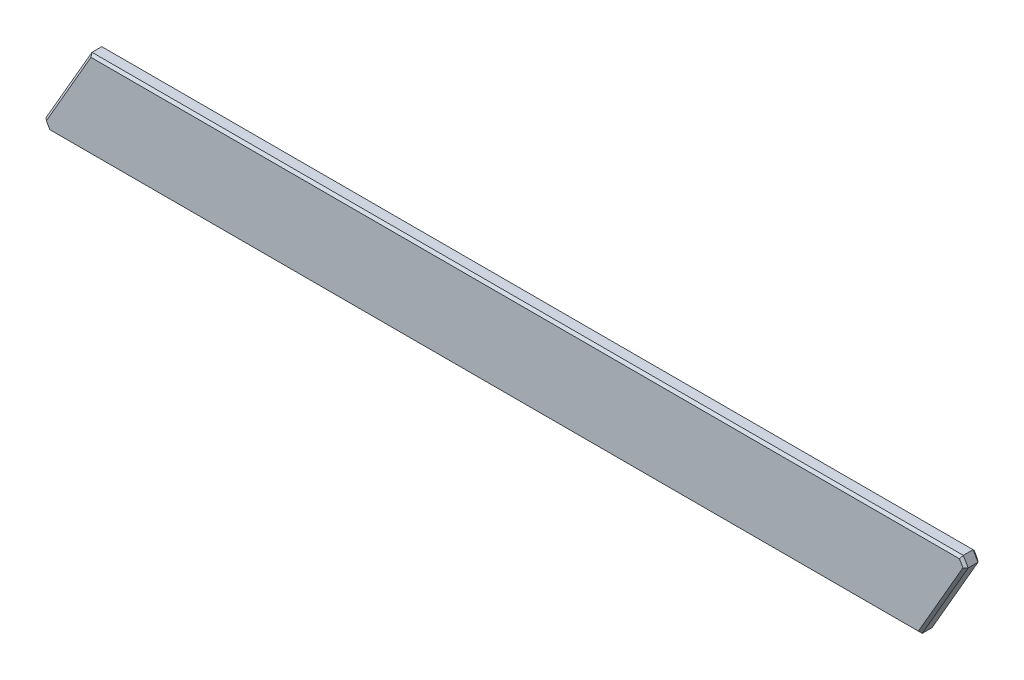
ISO-10303-21;
HEADER;
FILE_DESCRIPTION(('STEP AP214'),'2;1');
FILE_NAME('part.step','',(''),(''),'','','');
FILE_SCHEMA(('AUTOMOTIVE_DESIGN { 1 0 10303 214 1 1 1 1 }'));
ENDSEC;
DATA;
#1=APPLICATION_CONTEXT('core data for automotive mechanical design processes');
#2=APPLICATION_PROTOCOL_DEFINITION('international standard','automotive_design',2000,#1);
#3=PRODUCT_CONTEXT('',#1,'mechanical');
#4=PRODUCT('Part','Part','',(#3));
#5=PRODUCT_RELATED_PRODUCT_CATEGORY('part','',(#4));
#6=PRODUCT_DEFINITION_FORMATION('','',#4);
#7=PRODUCT_DEFINITION_CONTEXT('part definition',#1,'design');
#8=PRODUCT_DEFINITION('design','',#6,#7);
#9=PRODUCT_DEFINITION_SHAPE('','',#8);
#10=(LENGTH_UNIT() NAMED_UNIT(*) SI_UNIT(.MILLI.,.METRE.));
#11=(NAMED_UNIT(*) PLANE_ANGLE_UNIT() SI_UNIT($,.RADIAN.));
#12=(NAMED_UNIT(*) SI_UNIT($,.STERADIAN.) SOLID_ANGLE_UNIT());
#13=UNCERTAINTY_MEASURE_WITH_UNIT(LENGTH_MEASURE(1.E-05),#10,'distance_accuracy_value','');
#14=(GEOMETRIC_REPRESENTATION_CONTEXT(3) GLOBAL_UNCERTAINTY_ASSIGNED_CONTEXT((#13)) GLOBAL_UNIT_ASSIGNED_CONTEXT((#10,
#11,#12)) REPRESENTATION_CONTEXT('',''));
#15=CARTESIAN_POINT('',(0.,0.,0.));
#16=DIRECTION('',(0.,0.,1.));
#17=DIRECTION('',(1.,0.,0.));
#18=AXIS2_PLACEMENT_3D('',#15,#16,#17);
#19=CARTESIAN_POINT('',(94.1961524227066,7.26794919243112,3.));
#20=DIRECTION('',(-0.86602540378444,0.499999999999998,0.));
#21=DIRECTION('',(-0.499999999999998,-0.86602540378444,0.));
#22=AXIS2_PLACEMENT_3D('',#19,#20,#21);
#23=PLANE('',#22);
#24=DIRECTION('',(0.,0.,-1.));
#25=VECTOR('',#24,1.);
#26=CARTESIAN_POINT('',(84.8038475772934,-9.,3.));
#27=LINE('',#26,#25);
#28=CARTESIAN_POINT('',(84.8038475772934,-9.,2.49999999999998));
#29=VERTEX_POINT('',#28);
#30=CARTESIAN_POINT('',(84.8038475772934,-9.,0.5));
#31=VERTEX_POINT('',#30);
#32=EDGE_CURVE('E222',#29,#31,#27,.T.);
#33=ORIENTED_EDGE('',*,*,#32,.T.);
#34=DIRECTION('',(0.499999999999998,0.86602540378444,0.));
#35=VECTOR('',#34,1.);
#36=CARTESIAN_POINT('',(94.1961524227066,7.26794919243112,0.5));
#37=LINE('',#36,#35);
#38=CARTESIAN_POINT('',(94.1961524227066,7.26794919243112,0.5));
#39=VERTEX_POINT('',#38);
#40=EDGE_CURVE('E197',#31,#39,#37,.T.);
#41=ORIENTED_EDGE('',*,*,#40,.T.);
#42=DIRECTION('',(0.,0.,-1.));
#43=VECTOR('',#42,1.);
#44=CARTESIAN_POINT('',(94.1961524227066,7.26794919243112,3.));
#45=LINE('',#44,#43);
#46=CARTESIAN_POINT('',(94.1961524227066,7.26794919243112,2.49999999999998));
#47=VERTEX_POINT('',#46);
#48=EDGE_CURVE('E151',#47,#39,#45,.T.);
#49=ORIENTED_EDGE('',*,*,#48,.F.);
#50=DIRECTION('',(-0.499999999999998,-0.86602540378444,0.));
#51=VECTOR('',#50,1.);
#52=CARTESIAN_POINT('',(94.1961524227066,7.26794919243112,2.49999999999998));
#53=LINE('',#52,#51);
#54=EDGE_CURVE('E195',#47,#29,#53,.T.);
#55=ORIENTED_EDGE('',*,*,#54,.T.);
#56=EDGE_LOOP('',(#33,#41,#49,#55));
#57=FACE_BOUND('',#56,.T.);
#58=ADVANCED_FACE('F38',(#57),#23,.F.);
#59=CARTESIAN_POINT('',(93.1961524227066,9.,3.));
#60=DIRECTION('',(-0.866025403784439,-0.5,0.));
#61=DIRECTION('',(0.5,-0.866025403784439,0.));
#62=AXIS2_PLACEMENT_3D('',#59,#60,#61);
#63=PLANE('',#62);
#64=ORIENTED_EDGE('',*,*,#48,.T.);
#65=DIRECTION('',(-0.5,0.866025403784439,0.));
#66=VECTOR('',#65,1.);
#67=CARTESIAN_POINT('',(93.1961524227066,9.,0.5));
#68=LINE('',#67,#66);
#69=CARTESIAN_POINT('',(93.1961524227066,9.,0.5));
#70=VERTEX_POINT('',#69);
#71=EDGE_CURVE('E150',#39,#70,#68,.T.);
#72=ORIENTED_EDGE('',*,*,#71,.T.);
#73=DIRECTION('',(0.,0.,-1.));
#74=VECTOR('',#73,1.);
#75=CARTESIAN_POINT('',(93.1961524227066,9.,3.));
#76=LINE('',#75,#74);
#77=CARTESIAN_POINT('',(93.1961524227066,9.,2.49999999999997));
#78=VERTEX_POINT('',#77);
#79=EDGE_CURVE('E132',#78,#70,#76,.T.);
#80=ORIENTED_EDGE('',*,*,#79,.F.);
#81=DIRECTION('',(0.5,-0.866025403784439,0.));
#82=VECTOR('',#81,1.);
#83=CARTESIAN_POINT('',(93.1961524227066,9.,2.49999999999997));
#84=LINE('',#83,#82);
#85=EDGE_CURVE('E147',#78,#47,#84,.T.);
#86=ORIENTED_EDGE('',*,*,#85,.T.);
#87=EDGE_LOOP('',(#64,#72,#80,#86));
#88=FACE_BOUND('',#87,.T.);
#89=ADVANCED_FACE('F145',(#88),#63,.F.);
#90=CARTESIAN_POINT('',(-84.8038475772934,9.,3.));
#91=DIRECTION('',(0.,-1.,0.));
#92=DIRECTION('',(0.,0.,-1.));
#93=AXIS2_PLACEMENT_3D('',#90,#91,#92);
#94=PLANE('',#93);
#95=ORIENTED_EDGE('',*,*,#79,.T.);
#96=DIRECTION('',(-1.,0.,0.));
#97=VECTOR('',#96,1.);
#98=CARTESIAN_POINT('',(-84.8038475772934,9.,0.5));
#99=LINE('',#98,#97);
#100=CARTESIAN_POINT('',(-84.8038475772934,9.,0.5));
#101=VERTEX_POINT('',#100);
#102=EDGE_CURVE('E139',#70,#101,#99,.T.);
#103=ORIENTED_EDGE('',*,*,#102,.T.);
#104=DIRECTION('',(0.,0.,-1.));
#105=VECTOR('',#104,1.);
#106=CARTESIAN_POINT('',(-84.8038475772934,9.,3.));
#107=LINE('',#106,#105);
#108=CARTESIAN_POINT('',(-84.8038475772934,9.,2.49999999999997));
#109=VERTEX_POINT('',#108);
#110=EDGE_CURVE('E134',#109,#101,#107,.T.);
#111=ORIENTED_EDGE('',*,*,#110,.F.);
#112=DIRECTION('',(1.,0.,0.));
#113=VECTOR('',#112,1.);
#114=CARTESIAN_POINT('',(-84.8038475772934,9.,2.49999999999997));
#115=LINE('',#114,#113);
#116=EDGE_CURVE('E129',#109,#78,#115,.T.);
#117=ORIENTED_EDGE('',*,*,#116,.T.);
#118=EDGE_LOOP('',(#95,#103,#111,#117));
#119=FACE_BOUND('',#118,.T.);
#120=ADVANCED_FACE('F131',(#119),#94,.F.);
#121=CARTESIAN_POINT('',(-94.1961524227066,-7.26794919243114,3.));
#122=DIRECTION('',(0.86602540378444,-0.499999999999998,0.));
#123=DIRECTION('',(0.499999999999998,0.86602540378444,0.));
#124=AXIS2_PLACEMENT_3D('',#121,#122,#123);
#125=PLANE('',#124);
#126=ORIENTED_EDGE('',*,*,#110,.T.);
#127=DIRECTION('',(-0.499999999999998,-0.86602540378444,0.));
#128=VECTOR('',#127,1.);
#129=CARTESIAN_POINT('',(-94.1961524227066,-7.26794919243114,0.5));
#130=LINE('',#129,#128);
#131=CARTESIAN_POINT('',(-94.1961524227066,-7.26794919243114,0.5));
#132=VERTEX_POINT('',#131);
#133=EDGE_CURVE('E184',#101,#132,#130,.T.);
#134=ORIENTED_EDGE('',*,*,#133,.T.);
#135=DIRECTION('',(0.,0.,-1.));
#136=VECTOR('',#135,1.);
#137=CARTESIAN_POINT('',(-94.1961524227066,-7.26794919243114,3.));
#138=LINE('',#137,#136);
#139=CARTESIAN_POINT('',(-94.1961524227066,-7.26794919243114,2.49999999999997));
#140=VERTEX_POINT('',#139);
#141=EDGE_CURVE('E240',#140,#132,#138,.T.);
#142=ORIENTED_EDGE('',*,*,#141,.F.);
#143=DIRECTION('',(0.499999999999998,0.86602540378444,0.));
#144=VECTOR('',#143,1.);
#145=CARTESIAN_POINT('',(-94.1961524227066,-7.26794919243114,2.49999999999997));
#146=LINE('',#145,#144);
#147=EDGE_CURVE('E182',#140,#109,#146,.T.);
#148=ORIENTED_EDGE('',*,*,#147,.T.);
#149=EDGE_LOOP('',(#126,#134,#142,#148));
#150=FACE_BOUND('',#149,.T.);
#151=ADVANCED_FACE('F237',(#150),#125,.F.);
#152=CARTESIAN_POINT('',(-93.1961524227066,-9.00000000000002,3.));
#153=DIRECTION('',(0.866025403784436,0.500000000000004,0.));
#154=DIRECTION('',(-0.500000000000004,0.866025403784436,0.));
#155=AXIS2_PLACEMENT_3D('',#152,#153,#154);
#156=PLANE('',#155);
#157=ORIENTED_EDGE('',*,*,#141,.T.);
#158=DIRECTION('',(0.500000000000004,-0.866025403784436,0.));
#159=VECTOR('',#158,1.);
#160=CARTESIAN_POINT('',(-93.1961524227066,-9.00000000000002,0.5));
#161=LINE('',#160,#159);
#162=CARTESIAN_POINT('',(-93.1961524227066,-9.00000000000002,0.5));
#163=VERTEX_POINT('',#162);
#164=EDGE_CURVE('E188',#132,#163,#161,.T.);
#165=ORIENTED_EDGE('',*,*,#164,.T.);
#166=DIRECTION('',(0.,0.,-1.));
#167=VECTOR('',#166,1.);
#168=CARTESIAN_POINT('',(-93.1961524227066,-9.00000000000002,3.));
#169=LINE('',#168,#167);
#170=CARTESIAN_POINT('',(-93.1961524227066,-9.00000000000002,2.49999999999997));
#171=VERTEX_POINT('',#170);
#172=EDGE_CURVE('E243',#171,#163,#169,.T.);
#173=ORIENTED_EDGE('',*,*,#172,.F.);
#174=DIRECTION('',(-0.500000000000004,0.866025403784436,0.));
#175=VECTOR('',#174,1.);
#176=CARTESIAN_POINT('',(-93.1961524227066,-9.00000000000002,2.49999999999997));
#177=LINE('',#176,#175);
#178=EDGE_CURVE('E186',#171,#140,#177,.T.);
#179=ORIENTED_EDGE('',*,*,#178,.T.);
#180=EDGE_LOOP('',(#157,#165,#173,#179));
#181=FACE_BOUND('',#180,.T.);
#182=ADVANCED_FACE('F282',(#181),#156,.F.);
#183=CARTESIAN_POINT('',(84.8038475772934,-9.,3.));
#184=DIRECTION('',(0.,1.,0.));
#185=DIRECTION('',(-1.,0.,0.));
#186=AXIS2_PLACEMENT_3D('',#183,#184,#185);
#187=PLANE('',#186);
#188=ORIENTED_EDGE('',*,*,#172,.T.);
#189=DIRECTION('',(1.,0.,0.));
#190=VECTOR('',#189,1.);
#191=CARTESIAN_POINT('',(84.8038475772934,-9.,0.5));
#192=LINE('',#191,#190);
#193=EDGE_CURVE('E193',#163,#31,#192,.T.);
#194=ORIENTED_EDGE('',*,*,#193,.T.);
#195=ORIENTED_EDGE('',*,*,#32,.F.);
#196=DIRECTION('',(-1.,0.,0.));
#197=VECTOR('',#196,1.);
#198=CARTESIAN_POINT('',(84.8038475772934,-9.,2.49999999999997));
#199=LINE('',#198,#197);
#200=EDGE_CURVE('E190',#29,#171,#199,.T.);
#201=ORIENTED_EDGE('',*,*,#200,.T.);
#202=EDGE_LOOP('',(#188,#194,#195,#201));
#203=FACE_BOUND('',#202,.T.);
#204=ADVANCED_FACE('F283',(#203),#187,.F.);
#205=CARTESIAN_POINT('',(0.,0.,3.));
#206=DIRECTION('',(0.,0.,-1.));
#207=DIRECTION('',(-1.,0.,0.));
#208=AXIS2_PLACEMENT_3D('',#205,#206,#207);
#209=PLANE('',#208);
#210=DIRECTION('',(0.500000000000004,-0.866025403784436,0.));
#211=VECTOR('',#210,1.);
#212=CARTESIAN_POINT('',(-73.3612159321673,-42.3551177665155,3.));
#213=LINE('',#212,#211);
#214=CARTESIAN_POINT('',(-93.6188021535169,-7.26794919243115,3.));
#215=VERTEX_POINT('',#214);
#216=CARTESIAN_POINT('',(-92.9074772881117,-8.49999999999999,3.));
#217=VERTEX_POINT('',#216);
#218=EDGE_CURVE('E48',#215,#217,#213,.T.);
#219=ORIENTED_EDGE('',*,*,#218,.T.);
#220=DIRECTION('',(1.,0.,0.));
#221=VECTOR('',#220,1.);
#222=CARTESIAN_POINT('',(0.,-8.49999999999998,3.));
#223=LINE('',#222,#221);
#224=CARTESIAN_POINT('',(84.5151724426986,-8.49999999999997,3.));
#225=VERTEX_POINT('',#224);
#226=EDGE_CURVE('E11',#217,#225,#223,.T.);
#227=ORIENTED_EDGE('',*,*,#226,.T.);
#228=DIRECTION('',(0.499999999999998,0.86602540378444,0.));
#229=VECTOR('',#228,1.);
#230=CARTESIAN_POINT('',(67.066987298108,-38.7211431702996,3.));
#231=LINE('',#230,#229);
#232=CARTESIAN_POINT('',(93.618802153517,7.26794919243113,3.));
#233=VERTEX_POINT('',#232);
#234=EDGE_CURVE('E199',#225,#233,#231,.T.);
#235=ORIENTED_EDGE('',*,*,#234,.T.);
#236=DIRECTION('',(-0.5,0.866025403784439,0.));
#237=VECTOR('',#236,1.);
#238=CARTESIAN_POINT('',(73.3612159321677,42.3551177665153,3.));
#239=LINE('',#238,#237);
#240=CARTESIAN_POINT('',(92.9074772881118,8.49999999999997,3.));
#241=VERTEX_POINT('',#240);
#242=EDGE_CURVE('E201',#233,#241,#239,.T.);
#243=ORIENTED_EDGE('',*,*,#242,.T.);
#244=DIRECTION('',(-1.,0.,0.));
#245=VECTOR('',#244,1.);
#246=CARTESIAN_POINT('',(0.,8.49999999999997,3.));
#247=LINE('',#246,#245);
#248=CARTESIAN_POINT('',(-84.5151724426985,8.49999999999997,3.));
#249=VERTEX_POINT('',#248);
#250=EDGE_CURVE('E156',#241,#249,#247,.T.);
#251=ORIENTED_EDGE('',*,*,#250,.T.);
#252=DIRECTION('',(-0.499999999999998,-0.86602540378444,0.));
#253=VECTOR('',#252,1.);
#254=CARTESIAN_POINT('',(-67.0669872981079,38.7211431702996,3.));
#255=LINE('',#254,#253);
#256=EDGE_CURVE('E59',#249,#215,#255,.T.);
#257=ORIENTED_EDGE('',*,*,#256,.T.);
#258=EDGE_LOOP('',(#219,#227,#235,#243,#251,#257));
#259=FACE_BOUND('',#258,.T.);
#260=ADVANCED_FACE('F291',(#259),#209,.F.);
#261=CARTESIAN_POINT('',(0.,0.,0.));
#262=DIRECTION('',(0.,0.,-1.));
#263=DIRECTION('',(-1.,0.,0.));
#264=AXIS2_PLACEMENT_3D('',#261,#262,#263);
#265=PLANE('',#264);
#266=DIRECTION('',(1.,0.,0.));
#267=VECTOR('',#266,1.);
#268=CARTESIAN_POINT('',(93.1961524227066,8.49999999999998,0.));
#269=LINE('',#268,#267);
#270=CARTESIAN_POINT('',(-84.5151724426986,8.49999999999998,0.));
#271=VERTEX_POINT('',#270);
#272=CARTESIAN_POINT('',(92.9074772881118,8.49999999999998,0.));
#273=VERTEX_POINT('',#272);
#274=EDGE_CURVE('E177',#271,#273,#269,.T.);
#275=ORIENTED_EDGE('',*,*,#274,.T.);
#276=DIRECTION('',(0.5,-0.866025403784439,0.));
#277=VECTOR('',#276,1.);
#278=CARTESIAN_POINT('',(93.7631397208144,7.01794919243112,0.));
#279=LINE('',#278,#277);
#280=CARTESIAN_POINT('',(93.618802153517,7.26794919243113,0.));
#281=VERTEX_POINT('',#280);
#282=EDGE_CURVE('E140',#273,#281,#279,.T.);
#283=ORIENTED_EDGE('',*,*,#282,.T.);
#284=DIRECTION('',(-0.499999999999998,-0.86602540378444,0.));
#285=VECTOR('',#284,1.);
#286=CARTESIAN_POINT('',(84.3708348754012,-8.74999999999999,0.));
#287=LINE('',#286,#285);
#288=CARTESIAN_POINT('',(84.5151724426986,-8.49999999999998,0.));
#289=VERTEX_POINT('',#288);
#290=EDGE_CURVE('E166',#281,#289,#287,.T.);
#291=ORIENTED_EDGE('',*,*,#290,.T.);
#292=DIRECTION('',(-1.,0.,0.));
#293=VECTOR('',#292,1.);
#294=CARTESIAN_POINT('',(-93.1961524227066,-8.50000000000001,0.));
#295=LINE('',#294,#293);
#296=CARTESIAN_POINT('',(-92.9074772881118,-8.50000000000001,0.));
#297=VERTEX_POINT('',#296);
#298=EDGE_CURVE('E171',#289,#297,#295,.T.);
#299=ORIENTED_EDGE('',*,*,#298,.T.);
#300=DIRECTION('',(-0.500000000000004,0.866025403784436,0.));
#301=VECTOR('',#300,1.);
#302=CARTESIAN_POINT('',(-93.7631397208144,-7.01794919243113,0.));
#303=LINE('',#302,#301);
#304=CARTESIAN_POINT('',(-93.618802153517,-7.26794919243115,0.));
#305=VERTEX_POINT('',#304);
#306=EDGE_CURVE('E173',#297,#305,#303,.T.);
#307=ORIENTED_EDGE('',*,*,#306,.T.);
#308=DIRECTION('',(0.499999999999998,0.86602540378444,0.));
#309=VECTOR('',#308,1.);
#310=CARTESIAN_POINT('',(-84.3708348754011,8.74999999999999,0.));
#311=LINE('',#310,#309);
#312=EDGE_CURVE('E175',#305,#271,#311,.T.);
#313=ORIENTED_EDGE('',*,*,#312,.T.);
#314=EDGE_LOOP('',(#275,#283,#291,#299,#307,#313));
#315=FACE_BOUND('',#314,.T.);
#316=ADVANCED_FACE('F293',(#315),#265,.T.);
#317=CARTESIAN_POINT('',(-93.1961524227066,-9.00000000000002,0.5));
#318=DIRECTION('',(-0.612372435695788,-0.353553390593274,-0.707106781186552));
#319=DIRECTION('',(-0.500000000000004,0.866025403784436,0.));
#320=AXIS2_PLACEMENT_3D('',#317,#318,#319);
#321=PLANE('',#320);
#322=DIRECTION('',(0.755928946018465,0.,-0.654653670707965));
#323=VECTOR('',#322,1.);
#324=CARTESIAN_POINT('',(-93.624723851278,-7.26794919243115,0.0051283406945795));
#325=LINE('',#324,#323);
#326=EDGE_CURVE('E216',#305,#132,#325,.F.);
#327=ORIENTED_EDGE('',*,*,#326,.F.);
#328=ORIENTED_EDGE('',*,*,#306,.F.);
#329=DIRECTION('',(0.377964473009219,0.65465367070799,-0.654653670707969));
#330=VECTOR('',#329,1.);
#331=CARTESIAN_POINT('',(-67.7675809941363,35.0435776781799,-43.5435776781785));
#332=LINE('',#331,#330);
#333=EDGE_CURVE('E219',#163,#297,#332,.T.);
#334=ORIENTED_EDGE('',*,*,#333,.F.);
#335=ORIENTED_EDGE('',*,*,#164,.F.);
#336=EDGE_LOOP('',(#327,#328,#334,#335));
#337=FACE_BOUND('',#336,.T.);
#338=ADVANCED_FACE('F279',(#337),#321,.T.);
#339=CARTESIAN_POINT('',(84.8038475772934,-9.,0.5));
#340=DIRECTION('',(0.,-0.707106781186536,-0.707106781186559));
#341=DIRECTION('',(-1.,0.,0.));
#342=AXIS2_PLACEMENT_3D('',#339,#340,#341);
#343=PLANE('',#342);
#344=ORIENTED_EDGE('',*,*,#333,.T.);
#345=ORIENTED_EDGE('',*,*,#298,.F.);
#346=DIRECTION('',(-0.377964473009231,0.654653670707987,-0.654653670707966));
#347=VECTOR('',#346,1.);
#348=CARTESIAN_POINT('',(82.1203319071753,-4.35201451644809,-4.14798548355176));
#349=LINE('',#348,#347);
#350=EDGE_CURVE('E213',#31,#289,#349,.T.);
#351=ORIENTED_EDGE('',*,*,#350,.F.);
#352=ORIENTED_EDGE('',*,*,#193,.F.);
#353=EDGE_LOOP('',(#344,#345,#351,#352));
#354=FACE_BOUND('',#353,.T.);
#355=ADVANCED_FACE('F259',(#354),#343,.T.);
#356=CARTESIAN_POINT('',(-94.1961524227066,-7.26794919243114,0.5));
#357=DIRECTION('',(-0.612372435695781,0.353553390593264,-0.707106781186565));
#358=DIRECTION('',(0.499999999999998,0.86602540378444,0.));
#359=AXIS2_PLACEMENT_3D('',#356,#357,#358);
#360=PLANE('',#359);
#361=ORIENTED_EDGE('',*,*,#326,.T.);
#362=ORIENTED_EDGE('',*,*,#133,.F.);
#363=DIRECTION('',(0.377964473009244,-0.654653670707982,-0.654653670707962));
#364=VECTOR('',#363,1.);
#365=CARTESIAN_POINT('',(-82.1203319071752,4.35201451644824,-4.14798548355161));
#366=LINE('',#365,#364);
#367=EDGE_CURVE('E210',#271,#101,#366,.F.);
#368=ORIENTED_EDGE('',*,*,#367,.F.);
#369=ORIENTED_EDGE('',*,*,#312,.F.);
#370=EDGE_LOOP('',(#361,#362,#368,#369));
#371=FACE_BOUND('',#370,.T.);
#372=ADVANCED_FACE('F275',(#371),#360,.T.);
#373=CARTESIAN_POINT('',(94.1961524227066,7.26794919243112,0.5));
#374=DIRECTION('',(0.612372435695787,-0.353553390593267,-0.707106781186557));
#375=DIRECTION('',(-0.499999999999998,-0.86602540378444,0.));
#376=AXIS2_PLACEMENT_3D('',#373,#374,#375);
#377=PLANE('',#376);
#378=ORIENTED_EDGE('',*,*,#350,.T.);
#379=ORIENTED_EDGE('',*,*,#290,.F.);
#380=DIRECTION('',(0.75592894601846,0.,0.654653670707971));
#381=VECTOR('',#380,1.);
#382=CARTESIAN_POINT('',(94.1961524227066,7.26794919243112,0.5));
#383=LINE('',#382,#381);
#384=EDGE_CURVE('E208',#39,#281,#383,.F.);
#385=ORIENTED_EDGE('',*,*,#384,.F.);
#386=ORIENTED_EDGE('',*,*,#40,.F.);
#387=EDGE_LOOP('',(#378,#379,#385,#386));
#388=FACE_BOUND('',#387,.T.);
#389=ADVANCED_FACE('F263',(#388),#377,.T.);
#390=CARTESIAN_POINT('',(-84.8038475772934,9.,0.5));
#391=DIRECTION('',(0.,0.707106781186536,-0.707106781186559));
#392=DIRECTION('',(1.,0.,0.));
#393=AXIS2_PLACEMENT_3D('',#390,#391,#392);
#394=PLANE('',#393);
#395=ORIENTED_EDGE('',*,*,#367,.T.);
#396=ORIENTED_EDGE('',*,*,#102,.F.);
#397=DIRECTION('',(-0.377964473009216,-0.654653670707991,-0.65465367070797));
#398=VECTOR('',#397,1.);
#399=CARTESIAN_POINT('',(67.7675809941366,-35.0435776781797,-43.5435776781783));
#400=LINE('',#399,#398);
#401=EDGE_CURVE('E206',#273,#70,#400,.F.);
#402=ORIENTED_EDGE('',*,*,#401,.F.);
#403=ORIENTED_EDGE('',*,*,#274,.F.);
#404=EDGE_LOOP('',(#395,#396,#402,#403));
#405=FACE_BOUND('',#404,.T.);
#406=ADVANCED_FACE('F271',(#405),#394,.T.);
#407=CARTESIAN_POINT('',(93.1961524227066,9.,0.5));
#408=DIRECTION('',(0.612372435695792,0.353553390593273,-0.70710678118655));
#409=DIRECTION('',(0.5,-0.866025403784439,0.));
#410=AXIS2_PLACEMENT_3D('',#407,#408,#409);
#411=PLANE('',#410);
#412=ORIENTED_EDGE('',*,*,#384,.T.);
#413=ORIENTED_EDGE('',*,*,#282,.F.);
#414=ORIENTED_EDGE('',*,*,#401,.T.);
#415=ORIENTED_EDGE('',*,*,#71,.F.);
#416=EDGE_LOOP('',(#412,#413,#414,#415));
#417=FACE_BOUND('',#416,.T.);
#418=ADVANCED_FACE('F266',(#417),#411,.T.);
#419=CARTESIAN_POINT('',(0.,8.49999999999997,3.));
#420=DIRECTION('',(0.,-0.707106781186544,-0.707106781186551));
#421=DIRECTION('',(-1.,0.,0.));
#422=AXIS2_PLACEMENT_3D('',#419,#420,#421);
#423=PLANE('',#422);
#424=DIRECTION('',(-0.377964473009218,-0.654653670707983,0.654653670707976));
#425=VECTOR('',#424,1.);
#426=CARTESIAN_POINT('',(98.4921233898101,18.1728907904333,-6.6728907904332));
#427=LINE('',#426,#425);
#428=EDGE_CURVE('E155',#78,#241,#427,.T.);
#429=ORIENTED_EDGE('',*,*,#428,.F.);
#430=ORIENTED_EDGE('',*,*,#116,.F.);
#431=DIRECTION('',(0.377964473009237,-0.654653670707978,0.654653670707971));
#432=VECTOR('',#431,1.);
#433=CARTESIAN_POINT('',(-72.4415763794553,-12.4120818116004,23.9120818116002));
#434=LINE('',#433,#432);
#435=EDGE_CURVE('E43',#249,#109,#434,.F.);
#436=ORIENTED_EDGE('',*,*,#435,.F.);
#437=ORIENTED_EDGE('',*,*,#250,.F.);
#438=EDGE_LOOP('',(#429,#430,#436,#437));
#439=FACE_BOUND('',#438,.T.);
#440=ADVANCED_FACE('F41',(#439),#423,.F.);
#441=CARTESIAN_POINT('',(-67.0669872981079,38.7211431702996,3.));
#442=DIRECTION('',(0.612372435695789,-0.353553390593269,-0.707106781186555));
#443=DIRECTION('',(-0.499999999999998,-0.86602540378444,0.));
#444=AXIS2_PLACEMENT_3D('',#441,#442,#443);
#445=PLANE('',#444);
#446=ORIENTED_EDGE('',*,*,#435,.T.);
#447=ORIENTED_EDGE('',*,*,#147,.F.);
#448=DIRECTION('',(0.755928946018461,0.,0.654653670707969));
#449=VECTOR('',#448,1.);
#450=CARTESIAN_POINT('',(-78.4463365218543,-7.26794919243109,16.1397406750659));
#451=LINE('',#450,#449);
#452=EDGE_CURVE('E159',#215,#140,#451,.F.);
#453=ORIENTED_EDGE('',*,*,#452,.F.);
#454=ORIENTED_EDGE('',*,*,#256,.F.);
#455=EDGE_LOOP('',(#446,#447,#453,#454));
#456=FACE_BOUND('',#455,.T.);
#457=ADVANCED_FACE('F234',(#456),#445,.F.);
#458=CARTESIAN_POINT('',(73.3612159321677,42.3551177665153,3.));
#459=DIRECTION('',(-0.612372435695797,-0.353553390593275,-0.707106781186545));
#460=DIRECTION('',(-0.5,0.866025403784439,0.));
#461=AXIS2_PLACEMENT_3D('',#458,#459,#460);
#462=PLANE('',#461);
#463=ORIENTED_EDGE('',*,*,#428,.T.);
#464=ORIENTED_EDGE('',*,*,#242,.F.);
#465=DIRECTION('',(-0.755928946018454,0.,0.654653670707977));
#466=VECTOR('',#465,1.);
#467=CARTESIAN_POINT('',(78.446336521855,7.26794919243129,16.1397406750656));
#468=LINE('',#467,#466);
#469=EDGE_CURVE('E163',#47,#233,#468,.T.);
#470=ORIENTED_EDGE('',*,*,#469,.F.);
#471=ORIENTED_EDGE('',*,*,#85,.F.);
#472=EDGE_LOOP('',(#463,#464,#470,#471));
#473=FACE_BOUND('',#472,.T.);
#474=ADVANCED_FACE('F161',(#473),#462,.F.);
#475=CARTESIAN_POINT('',(-73.3612159321673,-42.3551177665155,3.));
#476=DIRECTION('',(0.612372435695786,0.353553390593273,-0.707106781186555));
#477=DIRECTION('',(0.500000000000004,-0.866025403784436,0.));
#478=AXIS2_PLACEMENT_3D('',#475,#476,#477);
#479=PLANE('',#478);
#480=ORIENTED_EDGE('',*,*,#452,.T.);
#481=ORIENTED_EDGE('',*,*,#178,.F.);
#482=DIRECTION('',(0.377964473009234,0.654653670707979,0.654653670707972));
#483=VECTOR('',#482,1.);
#484=CARTESIAN_POINT('',(-98.4921233898101,-18.1728907904329,-6.67289079043284));
#485=LINE('',#484,#483);
#486=EDGE_CURVE('E225',#217,#171,#485,.F.);
#487=ORIENTED_EDGE('',*,*,#486,.F.);
#488=ORIENTED_EDGE('',*,*,#218,.F.);
#489=EDGE_LOOP('',(#480,#481,#487,#488));
#490=FACE_BOUND('',#489,.T.);
#491=ADVANCED_FACE('F231',(#490),#479,.F.);
#492=CARTESIAN_POINT('',(67.066987298108,-38.7211431702996,3.));
#493=DIRECTION('',(-0.612372435695793,0.353553390593271,-0.70710678118655));
#494=DIRECTION('',(0.499999999999998,0.86602540378444,0.));
#495=AXIS2_PLACEMENT_3D('',#492,#493,#494);
#496=PLANE('',#495);
#497=ORIENTED_EDGE('',*,*,#469,.T.);
#498=ORIENTED_EDGE('',*,*,#234,.F.);
#499=DIRECTION('',(0.377964473009227,-0.654653670707981,-0.654653670707974));
#500=VECTOR('',#499,1.);
#501=CARTESIAN_POINT('',(89.500368198296,-17.1346123343714,-5.63461233437137));
#502=LINE('',#501,#500);
#503=EDGE_CURVE('E223',#29,#225,#502,.F.);
#504=ORIENTED_EDGE('',*,*,#503,.F.);
#505=ORIENTED_EDGE('',*,*,#54,.F.);
#506=EDGE_LOOP('',(#497,#498,#504,#505));
#507=FACE_BOUND('',#506,.T.);
#508=ADVANCED_FACE('F290',(#507),#496,.F.);
#509=CARTESIAN_POINT('',(0.,-8.49999999999998,3.));
#510=DIRECTION('',(0.,0.707106781186544,-0.707106781186551));
#511=DIRECTION('',(1.,0.,0.));
#512=AXIS2_PLACEMENT_3D('',#509,#510,#511);
#513=PLANE('',#512);
#514=ORIENTED_EDGE('',*,*,#486,.T.);
#515=ORIENTED_EDGE('',*,*,#200,.F.);
#516=ORIENTED_EDGE('',*,*,#503,.T.);
#517=ORIENTED_EDGE('',*,*,#226,.F.);
#518=EDGE_LOOP('',(#514,#515,#516,#517));
#519=FACE_BOUND('',#518,.T.);
#520=ADVANCED_FACE('F286',(#519),#513,.F.);
#521=CLOSED_SHELL('',(#58,#89,#120,#151,#182,#204,#260,#316,#338,#355,#372,#389,#406,#418,#440,
#457,#474,#491,#508,#520));
#522=MANIFOLD_SOLID_BREP('B2',#521);
#523=ADVANCED_BREP_SHAPE_REPRESENTATION('',(#18,#522),#14);
#524=SHAPE_DEFINITION_REPRESENTATION(#9,#523);
ENDSEC;
END-ISO-10303-21;
